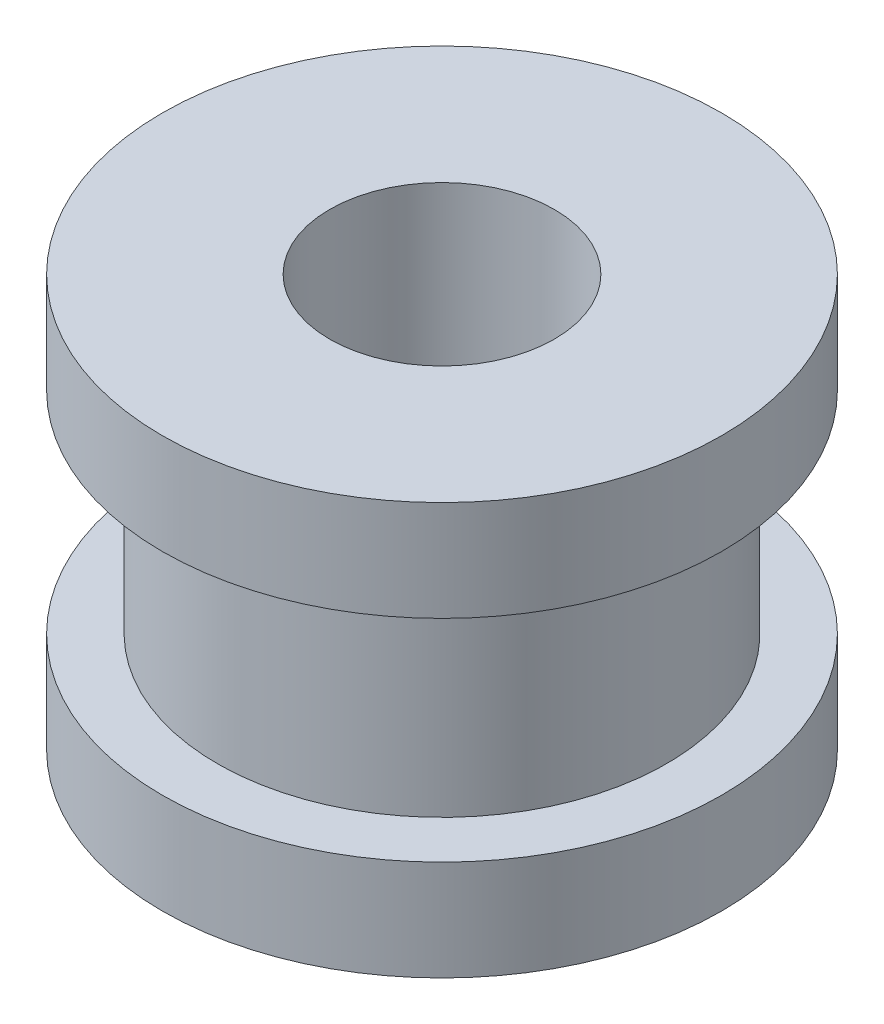
ISO-10303-21;
HEADER;
FILE_DESCRIPTION(('STEP AP214'),'2;1');
FILE_NAME('part.step','',(''),(''),'','','');
FILE_SCHEMA(('AUTOMOTIVE_DESIGN { 1 0 10303 214 1 1 1 1 }'));
ENDSEC;
DATA;
#1=APPLICATION_CONTEXT('core data for automotive mechanical design processes');
#2=APPLICATION_PROTOCOL_DEFINITION('international standard','automotive_design',2000,#1);
#3=PRODUCT_CONTEXT('',#1,'mechanical');
#4=PRODUCT('Part','Part','',(#3));
#5=PRODUCT_RELATED_PRODUCT_CATEGORY('part','',(#4));
#6=PRODUCT_DEFINITION_FORMATION('','',#4);
#7=PRODUCT_DEFINITION_CONTEXT('part definition',#1,'design');
#8=PRODUCT_DEFINITION('design','',#6,#7);
#9=PRODUCT_DEFINITION_SHAPE('','',#8);
#10=(LENGTH_UNIT() NAMED_UNIT(*) SI_UNIT(.MILLI.,.METRE.));
#11=(NAMED_UNIT(*) PLANE_ANGLE_UNIT() SI_UNIT($,.RADIAN.));
#12=(NAMED_UNIT(*) SI_UNIT($,.STERADIAN.) SOLID_ANGLE_UNIT());
#13=UNCERTAINTY_MEASURE_WITH_UNIT(LENGTH_MEASURE(1.E-05),#10,'distance_accuracy_value','');
#14=(GEOMETRIC_REPRESENTATION_CONTEXT(3) GLOBAL_UNCERTAINTY_ASSIGNED_CONTEXT((#13)) GLOBAL_UNIT_ASSIGNED_CONTEXT((#10,
#11,#12)) REPRESENTATION_CONTEXT('',''));
#15=CARTESIAN_POINT('',(0.,0.,0.));
#16=DIRECTION('',(0.,0.,1.));
#17=DIRECTION('',(1.,0.,0.));
#18=AXIS2_PLACEMENT_3D('',#15,#16,#17);
#19=CARTESIAN_POINT('',(4.1,7.51,0.));
#20=DIRECTION('',(0.,1.,0.));
#21=DIRECTION('',(-1.,0.,0.));
#22=AXIS2_PLACEMENT_3D('',#19,#20,#21);
#23=CYLINDRICAL_SURFACE('',#22,2.05);
#24=CARTESIAN_POINT('',(4.1,7.51,0.));
#25=DIRECTION('',(0.,1.,0.));
#26=DIRECTION('',(-1.,0.,0.));
#27=AXIS2_PLACEMENT_3D('',#24,#25,#26);
#28=CIRCLE('',#27,2.05);
#29=CARTESIAN_POINT('',(2.05,7.51,0.));
#30=VERTEX_POINT('',#29);
#31=EDGE_CURVE('E37',#30,#30,#28,.T.);
#32=ORIENTED_EDGE('',*,*,#31,.T.);
#33=EDGE_LOOP('',(#32));
#34=FACE_BOUND('',#33,.T.);
#35=CARTESIAN_POINT('',(4.1,0.,0.));
#36=DIRECTION('',(0.,1.,0.));
#37=DIRECTION('',(-1.,0.,0.));
#38=AXIS2_PLACEMENT_3D('',#35,#36,#37);
#39=CIRCLE('',#38,2.05);
#40=CARTESIAN_POINT('',(2.05,0.,0.));
#41=VERTEX_POINT('',#40);
#42=EDGE_CURVE('E10',#41,#41,#39,.T.);
#43=ORIENTED_EDGE('',*,*,#42,.F.);
#44=EDGE_LOOP('',(#43));
#45=FACE_BOUND('',#44,.T.);
#46=ADVANCED_FACE('F31',(#34,#45),#23,.F.);
#47=CARTESIAN_POINT('',(-1.,7.51,0.));
#48=DIRECTION('',(0.,1.,0.));
#49=DIRECTION('',(-1.,0.,0.));
#50=AXIS2_PLACEMENT_3D('',#47,#48,#49);
#51=PLANE('',#50);
#52=CARTESIAN_POINT('',(4.1,7.51,0.));
#53=DIRECTION('',(0.,1.,0.));
#54=DIRECTION('',(-1.,0.,0.));
#55=AXIS2_PLACEMENT_3D('',#52,#53,#54);
#56=CIRCLE('',#55,5.1);
#57=CARTESIAN_POINT('',(-1.,7.51,0.));
#58=VERTEX_POINT('',#57);
#59=EDGE_CURVE('E41',#58,#58,#56,.T.);
#60=ORIENTED_EDGE('',*,*,#59,.T.);
#61=EDGE_LOOP('',(#60));
#62=FACE_BOUND('',#61,.T.);
#63=ORIENTED_EDGE('',*,*,#31,.F.);
#64=EDGE_LOOP('',(#63));
#65=FACE_BOUND('',#64,.T.);
#66=ADVANCED_FACE('F75',(#62,#65),#51,.T.);
#67=CARTESIAN_POINT('',(4.1,7.51,0.));
#68=DIRECTION('',(0.,1.,0.));
#69=DIRECTION('',(-1.,0.,0.));
#70=AXIS2_PLACEMENT_3D('',#67,#68,#69);
#71=CYLINDRICAL_SURFACE('',#70,5.1);
#72=CARTESIAN_POINT('',(4.1,5.68,0.));
#73=DIRECTION('',(0.,1.,0.));
#74=DIRECTION('',(-1.,0.,0.));
#75=AXIS2_PLACEMENT_3D('',#72,#73,#74);
#76=CIRCLE('',#75,5.1);
#77=CARTESIAN_POINT('',(-1.,5.68,0.));
#78=VERTEX_POINT('',#77);
#79=EDGE_CURVE('E45',#78,#78,#76,.T.);
#80=ORIENTED_EDGE('',*,*,#79,.T.);
#81=EDGE_LOOP('',(#80));
#82=FACE_BOUND('',#81,.T.);
#83=ORIENTED_EDGE('',*,*,#59,.F.);
#84=EDGE_LOOP('',(#83));
#85=FACE_BOUND('',#84,.T.);
#86=ADVANCED_FACE('F79',(#82,#85),#71,.T.);
#87=CARTESIAN_POINT('',(0.,5.68,0.));
#88=DIRECTION('',(0.,-1.,0.));
#89=DIRECTION('',(1.,0.,0.));
#90=AXIS2_PLACEMENT_3D('',#87,#88,#89);
#91=PLANE('',#90);
#92=CARTESIAN_POINT('',(4.1,5.68,0.));
#93=DIRECTION('',(0.,1.,0.));
#94=DIRECTION('',(-1.,0.,0.));
#95=AXIS2_PLACEMENT_3D('',#92,#93,#94);
#96=CIRCLE('',#95,4.1);
#97=CARTESIAN_POINT('',(0.,5.68,0.));
#98=VERTEX_POINT('',#97);
#99=EDGE_CURVE('E50',#98,#98,#96,.T.);
#100=ORIENTED_EDGE('',*,*,#99,.T.);
#101=EDGE_LOOP('',(#100));
#102=FACE_BOUND('',#101,.T.);
#103=ORIENTED_EDGE('',*,*,#79,.F.);
#104=EDGE_LOOP('',(#103));
#105=FACE_BOUND('',#104,.T.);
#106=ADVANCED_FACE('F85',(#102,#105),#91,.T.);
#107=CARTESIAN_POINT('',(4.1,7.51,0.));
#108=DIRECTION('',(0.,1.,0.));
#109=DIRECTION('',(-1.,0.,0.));
#110=AXIS2_PLACEMENT_3D('',#107,#108,#109);
#111=CYLINDRICAL_SURFACE('',#110,4.1);
#112=CARTESIAN_POINT('',(4.1,1.83,0.));
#113=DIRECTION('',(0.,1.,0.));
#114=DIRECTION('',(-1.,0.,0.));
#115=AXIS2_PLACEMENT_3D('',#112,#113,#114);
#116=CIRCLE('',#115,4.1);
#117=CARTESIAN_POINT('',(0.,1.83,0.));
#118=VERTEX_POINT('',#117);
#119=EDGE_CURVE('E53',#118,#118,#116,.T.);
#120=ORIENTED_EDGE('',*,*,#119,.T.);
#121=EDGE_LOOP('',(#120));
#122=FACE_BOUND('',#121,.T.);
#123=ORIENTED_EDGE('',*,*,#99,.F.);
#124=EDGE_LOOP('',(#123));
#125=FACE_BOUND('',#124,.T.);
#126=ADVANCED_FACE('F92',(#122,#125),#111,.T.);
#127=CARTESIAN_POINT('',(-1.,1.83,0.));
#128=DIRECTION('',(0.,1.,0.));
#129=DIRECTION('',(-1.,0.,0.));
#130=AXIS2_PLACEMENT_3D('',#127,#128,#129);
#131=PLANE('',#130);
#132=CARTESIAN_POINT('',(4.1,1.83,0.));
#133=DIRECTION('',(0.,1.,0.));
#134=DIRECTION('',(-1.,0.,0.));
#135=AXIS2_PLACEMENT_3D('',#132,#133,#134);
#136=CIRCLE('',#135,5.1);
#137=CARTESIAN_POINT('',(-1.,1.83,0.));
#138=VERTEX_POINT('',#137);
#139=EDGE_CURVE('E56',#138,#138,#136,.T.);
#140=ORIENTED_EDGE('',*,*,#139,.T.);
#141=EDGE_LOOP('',(#140));
#142=FACE_BOUND('',#141,.T.);
#143=ORIENTED_EDGE('',*,*,#119,.F.);
#144=EDGE_LOOP('',(#143));
#145=FACE_BOUND('',#144,.T.);
#146=ADVANCED_FACE('F72',(#142,#145),#131,.T.);
#147=CARTESIAN_POINT('',(4.1,7.51,0.));
#148=DIRECTION('',(0.,1.,0.));
#149=DIRECTION('',(-1.,0.,0.));
#150=AXIS2_PLACEMENT_3D('',#147,#148,#149);
#151=CYLINDRICAL_SURFACE('',#150,5.1);
#152=CARTESIAN_POINT('',(4.1,0.,0.));
#153=DIRECTION('',(0.,1.,0.));
#154=DIRECTION('',(-1.,0.,0.));
#155=AXIS2_PLACEMENT_3D('',#152,#153,#154);
#156=CIRCLE('',#155,5.1);
#157=CARTESIAN_POINT('',(-1.,0.,0.));
#158=VERTEX_POINT('',#157);
#159=EDGE_CURVE('E59',#158,#158,#156,.T.);
#160=ORIENTED_EDGE('',*,*,#159,.T.);
#161=EDGE_LOOP('',(#160));
#162=FACE_BOUND('',#161,.T.);
#163=ORIENTED_EDGE('',*,*,#139,.F.);
#164=EDGE_LOOP('',(#163));
#165=FACE_BOUND('',#164,.T.);
#166=ADVANCED_FACE('F63',(#162,#165),#151,.T.);
#167=CARTESIAN_POINT('',(0.,0.,0.));
#168=DIRECTION('',(0.,-1.,0.));
#169=DIRECTION('',(1.,0.,0.));
#170=AXIS2_PLACEMENT_3D('',#167,#168,#169);
#171=PLANE('',#170);
#172=ORIENTED_EDGE('',*,*,#42,.T.);
#173=EDGE_LOOP('',(#172));
#174=FACE_BOUND('',#173,.T.);
#175=ORIENTED_EDGE('',*,*,#159,.F.);
#176=EDGE_LOOP('',(#175));
#177=FACE_BOUND('',#176,.T.);
#178=ADVANCED_FACE('F66',(#174,#177),#171,.T.);
#179=CLOSED_SHELL('',(#46,#66,#86,#106,#126,#146,#166,#178));
#180=MANIFOLD_SOLID_BREP('B2',#179);
#181=ADVANCED_BREP_SHAPE_REPRESENTATION('',(#18,#180),#14);
#182=SHAPE_DEFINITION_REPRESENTATION(#9,#181);
ENDSEC;
END-ISO-10303-21;
